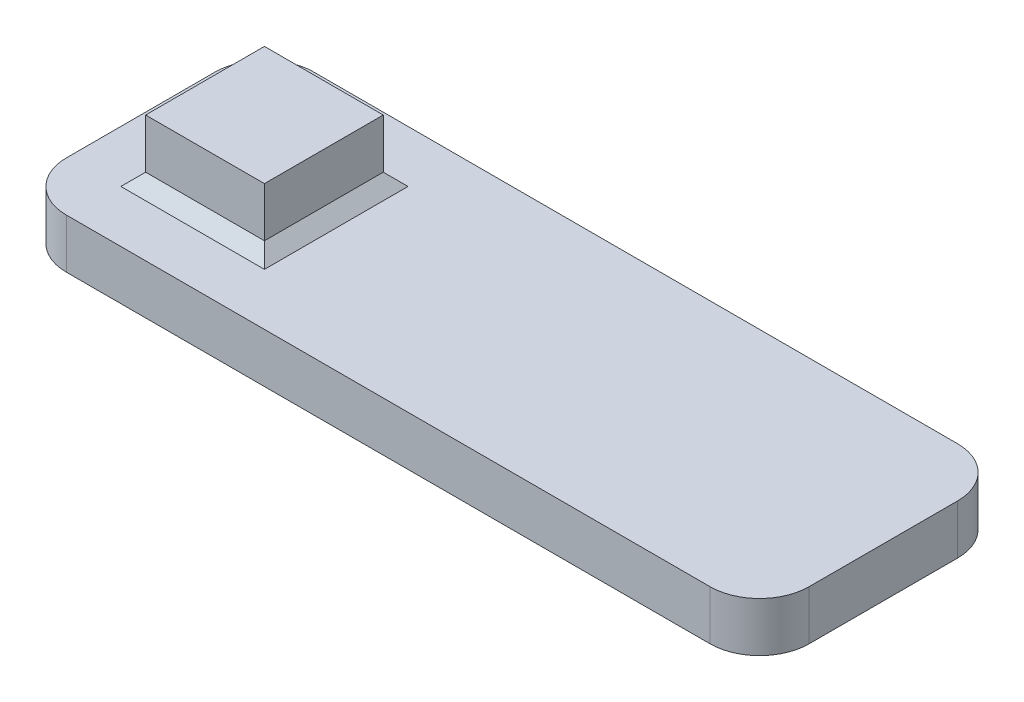
ISO-10303-21;
HEADER;
FILE_DESCRIPTION(('STEP AP214'),'2;1');
FILE_NAME('part.step','',(''),(''),'','','');
FILE_SCHEMA(('AUTOMOTIVE_DESIGN { 1 0 10303 214 1 1 1 1 }'));
ENDSEC;
DATA;
#1=APPLICATION_CONTEXT('core data for automotive mechanical design processes');
#2=APPLICATION_PROTOCOL_DEFINITION('international standard','automotive_design',2000,#1);
#3=PRODUCT_CONTEXT('',#1,'mechanical');
#4=PRODUCT('Part','Part','',(#3));
#5=PRODUCT_RELATED_PRODUCT_CATEGORY('part','',(#4));
#6=PRODUCT_DEFINITION_FORMATION('','',#4);
#7=PRODUCT_DEFINITION_CONTEXT('part definition',#1,'design');
#8=PRODUCT_DEFINITION('design','',#6,#7);
#9=PRODUCT_DEFINITION_SHAPE('','',#8);
#10=(LENGTH_UNIT() NAMED_UNIT(*) SI_UNIT(.MILLI.,.METRE.));
#11=(NAMED_UNIT(*) PLANE_ANGLE_UNIT() SI_UNIT($,.RADIAN.));
#12=(NAMED_UNIT(*) SI_UNIT($,.STERADIAN.) SOLID_ANGLE_UNIT());
#13=UNCERTAINTY_MEASURE_WITH_UNIT(LENGTH_MEASURE(1.E-05),#10,'distance_accuracy_value','');
#14=(GEOMETRIC_REPRESENTATION_CONTEXT(3) GLOBAL_UNCERTAINTY_ASSIGNED_CONTEXT((#13)) GLOBAL_UNIT_ASSIGNED_CONTEXT((#10,
#11,#12)) REPRESENTATION_CONTEXT('',''));
#15=CARTESIAN_POINT('',(0.,0.,0.));
#16=DIRECTION('',(0.,0.,1.));
#17=DIRECTION('',(1.,0.,0.));
#18=AXIS2_PLACEMENT_3D('',#15,#16,#17);
#19=CARTESIAN_POINT('',(28.,2.,-2.));
#20=DIRECTION('',(0.,1.,0.));
#21=DIRECTION('',(0.,0.,1.));
#22=AXIS2_PLACEMENT_3D('',#19,#20,#21);
#23=CYLINDRICAL_SURFACE('',#22,2.);
#24=DIRECTION('',(0.,1.,0.));
#25=VECTOR('',#24,1.);
#26=CARTESIAN_POINT('',(28.,2.,0.));
#27=LINE('',#26,#25);
#28=CARTESIAN_POINT('',(28.,0.,0.));
#29=VERTEX_POINT('',#28);
#30=CARTESIAN_POINT('',(28.,2.,0.));
#31=VERTEX_POINT('',#30);
#32=EDGE_CURVE('E235',#29,#31,#27,.T.);
#33=ORIENTED_EDGE('',*,*,#32,.F.);
#34=CARTESIAN_POINT('',(28.,0.,-2.));
#35=DIRECTION('',(0.,-1.,0.));
#36=DIRECTION('',(0.,0.,-1.));
#37=AXIS2_PLACEMENT_3D('',#34,#35,#36);
#38=CIRCLE('',#37,2.);
#39=CARTESIAN_POINT('',(30.,0.,-2.));
#40=VERTEX_POINT('',#39);
#41=EDGE_CURVE('E40',#40,#29,#38,.T.);
#42=ORIENTED_EDGE('',*,*,#41,.F.);
#43=DIRECTION('',(0.,1.,0.));
#44=VECTOR('',#43,1.);
#45=CARTESIAN_POINT('',(30.,2.,-2.));
#46=LINE('',#45,#44);
#47=CARTESIAN_POINT('',(30.,2.,-2.));
#48=VERTEX_POINT('',#47);
#49=EDGE_CURVE('E238',#48,#40,#46,.F.);
#50=ORIENTED_EDGE('',*,*,#49,.F.);
#51=CARTESIAN_POINT('',(28.,2.,-2.));
#52=DIRECTION('',(0.,-1.,0.));
#53=DIRECTION('',(0.,0.,-1.));
#54=AXIS2_PLACEMENT_3D('',#51,#52,#53);
#55=CIRCLE('',#54,2.);
#56=EDGE_CURVE('E11',#31,#48,#55,.F.);
#57=ORIENTED_EDGE('',*,*,#56,.F.);
#58=EDGE_LOOP('',(#33,#42,#50,#57));
#59=FACE_BOUND('',#58,.T.);
#60=ADVANCED_FACE('F33',(#59),#23,.T.);
#61=CARTESIAN_POINT('',(28.,2.,-8.));
#62=DIRECTION('',(0.,1.,0.));
#63=DIRECTION('',(0.,0.,1.));
#64=AXIS2_PLACEMENT_3D('',#61,#62,#63);
#65=CYLINDRICAL_SURFACE('',#64,2.);
#66=DIRECTION('',(0.,1.,0.));
#67=VECTOR('',#66,1.);
#68=CARTESIAN_POINT('',(30.,2.,-8.));
#69=LINE('',#68,#67);
#70=CARTESIAN_POINT('',(30.,0.,-8.));
#71=VERTEX_POINT('',#70);
#72=CARTESIAN_POINT('',(30.,2.,-8.));
#73=VERTEX_POINT('',#72);
#74=EDGE_CURVE('E224',#71,#73,#69,.T.);
#75=ORIENTED_EDGE('',*,*,#74,.F.);
#76=CARTESIAN_POINT('',(28.,0.,-8.));
#77=DIRECTION('',(0.,-1.,0.));
#78=DIRECTION('',(0.,0.,-1.));
#79=AXIS2_PLACEMENT_3D('',#76,#77,#78);
#80=CIRCLE('',#79,2.);
#81=CARTESIAN_POINT('',(28.,0.,-10.));
#82=VERTEX_POINT('',#81);
#83=EDGE_CURVE('E230',#82,#71,#80,.T.);
#84=ORIENTED_EDGE('',*,*,#83,.F.);
#85=DIRECTION('',(0.,1.,0.));
#86=VECTOR('',#85,1.);
#87=CARTESIAN_POINT('',(28.,2.,-10.));
#88=LINE('',#87,#86);
#89=CARTESIAN_POINT('',(28.,2.,-10.));
#90=VERTEX_POINT('',#89);
#91=EDGE_CURVE('E227',#90,#82,#88,.F.);
#92=ORIENTED_EDGE('',*,*,#91,.F.);
#93=CARTESIAN_POINT('',(28.,2.,-8.));
#94=DIRECTION('',(0.,-1.,0.));
#95=DIRECTION('',(0.,0.,-1.));
#96=AXIS2_PLACEMENT_3D('',#93,#94,#95);
#97=CIRCLE('',#96,2.);
#98=EDGE_CURVE('E233',#73,#90,#97,.F.);
#99=ORIENTED_EDGE('',*,*,#98,.F.);
#100=EDGE_LOOP('',(#75,#84,#92,#99));
#101=FACE_BOUND('',#100,.T.);
#102=ADVANCED_FACE('F268',(#101),#65,.T.);
#103=CARTESIAN_POINT('',(2.,2.,-8.));
#104=DIRECTION('',(0.,1.,0.));
#105=DIRECTION('',(0.,0.,1.));
#106=AXIS2_PLACEMENT_3D('',#103,#104,#105);
#107=CYLINDRICAL_SURFACE('',#106,2.);
#108=DIRECTION('',(0.,1.,0.));
#109=VECTOR('',#108,1.);
#110=CARTESIAN_POINT('',(2.,2.,-10.));
#111=LINE('',#110,#109);
#112=CARTESIAN_POINT('',(2.,0.,-10.));
#113=VERTEX_POINT('',#112);
#114=CARTESIAN_POINT('',(2.,2.,-10.));
#115=VERTEX_POINT('',#114);
#116=EDGE_CURVE('E213',#113,#115,#111,.T.);
#117=ORIENTED_EDGE('',*,*,#116,.F.);
#118=CARTESIAN_POINT('',(2.,0.,-8.));
#119=DIRECTION('',(0.,-1.,0.));
#120=DIRECTION('',(0.,0.,-1.));
#121=AXIS2_PLACEMENT_3D('',#118,#119,#120);
#122=CIRCLE('',#121,2.);
#123=CARTESIAN_POINT('',(0.,0.,-8.));
#124=VERTEX_POINT('',#123);
#125=EDGE_CURVE('E219',#124,#113,#122,.T.);
#126=ORIENTED_EDGE('',*,*,#125,.F.);
#127=DIRECTION('',(0.,1.,0.));
#128=VECTOR('',#127,1.);
#129=CARTESIAN_POINT('',(0.,2.,-8.));
#130=LINE('',#129,#128);
#131=CARTESIAN_POINT('',(0.,2.,-8.));
#132=VERTEX_POINT('',#131);
#133=EDGE_CURVE('E216',#132,#124,#130,.F.);
#134=ORIENTED_EDGE('',*,*,#133,.F.);
#135=CARTESIAN_POINT('',(2.,2.,-8.));
#136=DIRECTION('',(0.,-1.,0.));
#137=DIRECTION('',(0.,0.,-1.));
#138=AXIS2_PLACEMENT_3D('',#135,#136,#137);
#139=CIRCLE('',#138,2.);
#140=EDGE_CURVE('E222',#115,#132,#139,.F.);
#141=ORIENTED_EDGE('',*,*,#140,.F.);
#142=EDGE_LOOP('',(#117,#126,#134,#141));
#143=FACE_BOUND('',#142,.T.);
#144=ADVANCED_FACE('F260',(#143),#107,.T.);
#145=CARTESIAN_POINT('',(2.,2.,-2.));
#146=DIRECTION('',(0.,1.,0.));
#147=DIRECTION('',(0.,0.,1.));
#148=AXIS2_PLACEMENT_3D('',#145,#146,#147);
#149=CYLINDRICAL_SURFACE('',#148,2.);
#150=DIRECTION('',(0.,1.,0.));
#151=VECTOR('',#150,1.);
#152=CARTESIAN_POINT('',(0.,2.,-2.));
#153=LINE('',#152,#151);
#154=CARTESIAN_POINT('',(0.,0.,-2.));
#155=VERTEX_POINT('',#154);
#156=CARTESIAN_POINT('',(0.,2.,-2.));
#157=VERTEX_POINT('',#156);
#158=EDGE_CURVE('E193',#155,#157,#153,.T.);
#159=ORIENTED_EDGE('',*,*,#158,.F.);
#160=CARTESIAN_POINT('',(2.,0.,-2.));
#161=DIRECTION('',(0.,-1.,0.));
#162=DIRECTION('',(0.,0.,-1.));
#163=AXIS2_PLACEMENT_3D('',#160,#161,#162);
#164=CIRCLE('',#163,2.);
#165=CARTESIAN_POINT('',(2.,0.,0.));
#166=VERTEX_POINT('',#165);
#167=EDGE_CURVE('E208',#166,#155,#164,.T.);
#168=ORIENTED_EDGE('',*,*,#167,.F.);
#169=DIRECTION('',(0.,1.,0.));
#170=VECTOR('',#169,1.);
#171=CARTESIAN_POINT('',(2.,2.,0.));
#172=LINE('',#171,#170);
#173=CARTESIAN_POINT('',(2.,2.,0.));
#174=VERTEX_POINT('',#173);
#175=EDGE_CURVE('E205',#174,#166,#172,.F.);
#176=ORIENTED_EDGE('',*,*,#175,.F.);
#177=CARTESIAN_POINT('',(2.,2.,-2.));
#178=DIRECTION('',(0.,-1.,0.));
#179=DIRECTION('',(0.,0.,-1.));
#180=AXIS2_PLACEMENT_3D('',#177,#178,#179);
#181=CIRCLE('',#180,2.);
#182=EDGE_CURVE('E211',#157,#174,#181,.F.);
#183=ORIENTED_EDGE('',*,*,#182,.F.);
#184=EDGE_LOOP('',(#159,#168,#176,#183));
#185=FACE_BOUND('',#184,.T.);
#186=ADVANCED_FACE('F250',(#185),#149,.T.);
#187=CARTESIAN_POINT('',(0.,2.,0.));
#188=DIRECTION('',(0.,-1.,0.));
#189=DIRECTION('',(0.,0.,-1.));
#190=AXIS2_PLACEMENT_3D('',#187,#188,#189);
#191=PLANE('',#190);
#192=DIRECTION('',(1.,0.,0.));
#193=VECTOR('',#192,1.);
#194=CARTESIAN_POINT('',(7.4,2.,-7.89999999999999));
#195=LINE('',#194,#193);
#196=CARTESIAN_POINT('',(2.10000000000001,2.,-7.89999999999999));
#197=VERTEX_POINT('',#196);
#198=CARTESIAN_POINT('',(7.89999999999999,2.,-7.89999999999999));
#199=VERTEX_POINT('',#198);
#200=EDGE_CURVE('E182',#197,#199,#195,.T.);
#201=ORIENTED_EDGE('',*,*,#200,.T.);
#202=DIRECTION('',(0.,0.,1.));
#203=VECTOR('',#202,1.);
#204=CARTESIAN_POINT('',(7.89999999999999,2.,-2.6));
#205=LINE('',#204,#203);
#206=CARTESIAN_POINT('',(7.89999999999999,2.,-2.10000000000001));
#207=VERTEX_POINT('',#206);
#208=EDGE_CURVE('E184',#199,#207,#205,.T.);
#209=ORIENTED_EDGE('',*,*,#208,.T.);
#210=DIRECTION('',(-1.,0.,0.));
#211=VECTOR('',#210,1.);
#212=CARTESIAN_POINT('',(2.6,2.,-2.10000000000001));
#213=LINE('',#212,#211);
#214=CARTESIAN_POINT('',(2.10000000000001,2.,-2.10000000000001));
#215=VERTEX_POINT('',#214);
#216=EDGE_CURVE('E178',#207,#215,#213,.T.);
#217=ORIENTED_EDGE('',*,*,#216,.T.);
#218=DIRECTION('',(0.,0.,-1.));
#219=VECTOR('',#218,1.);
#220=CARTESIAN_POINT('',(2.10000000000001,2.,-7.4));
#221=LINE('',#220,#219);
#222=EDGE_CURVE('E180',#215,#197,#221,.T.);
#223=ORIENTED_EDGE('',*,*,#222,.T.);
#224=EDGE_LOOP('',(#201,#209,#217,#223));
#225=FACE_BOUND('',#224,.T.);
#226=DIRECTION('',(1.,0.,0.));
#227=VECTOR('',#226,1.);
#228=CARTESIAN_POINT('',(0.,2.,0.));
#229=LINE('',#228,#227);
#230=EDGE_CURVE('E165',#174,#31,#229,.T.);
#231=ORIENTED_EDGE('',*,*,#230,.T.);
#232=ORIENTED_EDGE('',*,*,#56,.T.);
#233=DIRECTION('',(0.,0.,-1.));
#234=VECTOR('',#233,1.);
#235=CARTESIAN_POINT('',(30.,2.,0.));
#236=LINE('',#235,#234);
#237=EDGE_CURVE('E168',#48,#73,#236,.T.);
#238=ORIENTED_EDGE('',*,*,#237,.T.);
#239=ORIENTED_EDGE('',*,*,#98,.T.);
#240=DIRECTION('',(-1.,0.,0.));
#241=VECTOR('',#240,1.);
#242=CARTESIAN_POINT('',(0.,2.,-10.));
#243=LINE('',#242,#241);
#244=EDGE_CURVE('E170',#90,#115,#243,.T.);
#245=ORIENTED_EDGE('',*,*,#244,.T.);
#246=ORIENTED_EDGE('',*,*,#140,.T.);
#247=DIRECTION('',(0.,0.,1.));
#248=VECTOR('',#247,1.);
#249=CARTESIAN_POINT('',(0.,2.,0.));
#250=LINE('',#249,#248);
#251=EDGE_CURVE('E163',#132,#157,#250,.T.);
#252=ORIENTED_EDGE('',*,*,#251,.T.);
#253=ORIENTED_EDGE('',*,*,#182,.T.);
#254=EDGE_LOOP('',(#231,#232,#238,#239,#245,#246,#252,#253));
#255=FACE_BOUND('',#254,.T.);
#256=ADVANCED_FACE('F272',(#225,#255),#191,.F.);
#257=CARTESIAN_POINT('',(0.,2.,0.));
#258=DIRECTION('',(1.,0.,0.));
#259=DIRECTION('',(0.,0.,-1.));
#260=AXIS2_PLACEMENT_3D('',#257,#258,#259);
#261=PLANE('',#260);
#262=ORIENTED_EDGE('',*,*,#251,.F.);
#263=ORIENTED_EDGE('',*,*,#133,.T.);
#264=DIRECTION('',(0.,0.,1.));
#265=VECTOR('',#264,1.);
#266=CARTESIAN_POINT('',(0.,0.,0.));
#267=LINE('',#266,#265);
#268=EDGE_CURVE('E155',#124,#155,#267,.T.);
#269=ORIENTED_EDGE('',*,*,#268,.T.);
#270=ORIENTED_EDGE('',*,*,#158,.T.);
#271=EDGE_LOOP('',(#262,#263,#269,#270));
#272=FACE_BOUND('',#271,.T.);
#273=ADVANCED_FACE('F256',(#272),#261,.F.);
#274=CARTESIAN_POINT('',(0.,2.,0.));
#275=DIRECTION('',(0.,0.,-1.));
#276=DIRECTION('',(-1.,0.,0.));
#277=AXIS2_PLACEMENT_3D('',#274,#275,#276);
#278=PLANE('',#277);
#279=DIRECTION('',(1.,0.,0.));
#280=VECTOR('',#279,1.);
#281=CARTESIAN_POINT('',(0.,0.,0.));
#282=LINE('',#281,#280);
#283=EDGE_CURVE('E157',#166,#29,#282,.T.);
#284=ORIENTED_EDGE('',*,*,#283,.T.);
#285=ORIENTED_EDGE('',*,*,#32,.T.);
#286=ORIENTED_EDGE('',*,*,#230,.F.);
#287=ORIENTED_EDGE('',*,*,#175,.T.);
#288=EDGE_LOOP('',(#284,#285,#286,#287));
#289=FACE_BOUND('',#288,.T.);
#290=ADVANCED_FACE('F245',(#289),#278,.F.);
#291=CARTESIAN_POINT('',(30.,2.,0.));
#292=DIRECTION('',(-1.,0.,0.));
#293=DIRECTION('',(0.,0.,1.));
#294=AXIS2_PLACEMENT_3D('',#291,#292,#293);
#295=PLANE('',#294);
#296=ORIENTED_EDGE('',*,*,#237,.F.);
#297=ORIENTED_EDGE('',*,*,#49,.T.);
#298=DIRECTION('',(0.,0.,-1.));
#299=VECTOR('',#298,1.);
#300=CARTESIAN_POINT('',(30.,0.,0.));
#301=LINE('',#300,#299);
#302=EDGE_CURVE('E174',#40,#71,#301,.T.);
#303=ORIENTED_EDGE('',*,*,#302,.T.);
#304=ORIENTED_EDGE('',*,*,#74,.T.);
#305=EDGE_LOOP('',(#296,#297,#303,#304));
#306=FACE_BOUND('',#305,.T.);
#307=ADVANCED_FACE('F271',(#306),#295,.F.);
#308=CARTESIAN_POINT('',(0.,2.,-10.));
#309=DIRECTION('',(0.,0.,1.));
#310=DIRECTION('',(1.,0.,0.));
#311=AXIS2_PLACEMENT_3D('',#308,#309,#310);
#312=PLANE('',#311);
#313=ORIENTED_EDGE('',*,*,#244,.F.);
#314=ORIENTED_EDGE('',*,*,#91,.T.);
#315=DIRECTION('',(-1.,0.,0.));
#316=VECTOR('',#315,1.);
#317=CARTESIAN_POINT('',(0.,0.,-10.));
#318=LINE('',#317,#316);
#319=EDGE_CURVE('E166',#82,#113,#318,.T.);
#320=ORIENTED_EDGE('',*,*,#319,.T.);
#321=ORIENTED_EDGE('',*,*,#116,.T.);
#322=EDGE_LOOP('',(#313,#314,#320,#321));
#323=FACE_BOUND('',#322,.T.);
#324=ADVANCED_FACE('F263',(#323),#312,.F.);
#325=CARTESIAN_POINT('',(0.,0.,0.));
#326=DIRECTION('',(0.,-1.,0.));
#327=DIRECTION('',(0.,0.,-1.));
#328=AXIS2_PLACEMENT_3D('',#325,#326,#327);
#329=PLANE('',#328);
#330=ORIENTED_EDGE('',*,*,#302,.F.);
#331=ORIENTED_EDGE('',*,*,#41,.T.);
#332=ORIENTED_EDGE('',*,*,#283,.F.);
#333=ORIENTED_EDGE('',*,*,#167,.T.);
#334=ORIENTED_EDGE('',*,*,#268,.F.);
#335=ORIENTED_EDGE('',*,*,#125,.T.);
#336=ORIENTED_EDGE('',*,*,#319,.F.);
#337=ORIENTED_EDGE('',*,*,#83,.T.);
#338=EDGE_LOOP('',(#330,#331,#332,#333,#334,#335,#336,#337));
#339=FACE_BOUND('',#338,.T.);
#340=ADVANCED_FACE('F242',(#339),#329,.T.);
#341=CARTESIAN_POINT('',(7.4,4.5,-7.4));
#342=DIRECTION('',(-1.,0.,0.));
#343=DIRECTION('',(0.,0.,1.));
#344=AXIS2_PLACEMENT_3D('',#341,#342,#343);
#345=PLANE('',#344);
#346=DIRECTION('',(0.,-1.,0.));
#347=VECTOR('',#346,1.);
#348=CARTESIAN_POINT('',(7.4,4.5,-2.6));
#349=LINE('',#348,#347);
#350=CARTESIAN_POINT('',(7.4,4.5,-2.6));
#351=VERTEX_POINT('',#350);
#352=CARTESIAN_POINT('',(7.4,2.5,-2.6));
#353=VERTEX_POINT('',#352);
#354=EDGE_CURVE('E440',#351,#353,#349,.T.);
#355=ORIENTED_EDGE('',*,*,#354,.T.);
#356=DIRECTION('',(0.,0.,-1.));
#357=VECTOR('',#356,1.);
#358=CARTESIAN_POINT('',(7.4,2.5,-7.4));
#359=LINE('',#358,#357);
#360=CARTESIAN_POINT('',(7.4,2.5,-7.4));
#361=VERTEX_POINT('',#360);
#362=EDGE_CURVE('E154',#353,#361,#359,.T.);
#363=ORIENTED_EDGE('',*,*,#362,.T.);
#364=DIRECTION('',(0.,-1.,0.));
#365=VECTOR('',#364,1.);
#366=CARTESIAN_POINT('',(7.4,4.5,-7.4));
#367=LINE('',#366,#365);
#368=CARTESIAN_POINT('',(7.4,4.5,-7.4));
#369=VERTEX_POINT('',#368);
#370=EDGE_CURVE('E134',#369,#361,#367,.T.);
#371=ORIENTED_EDGE('',*,*,#370,.F.);
#372=DIRECTION('',(0.,0.,-1.));
#373=VECTOR('',#372,1.);
#374=CARTESIAN_POINT('',(7.4,4.5,-7.4));
#375=LINE('',#374,#373);
#376=EDGE_CURVE('E140',#351,#369,#375,.T.);
#377=ORIENTED_EDGE('',*,*,#376,.F.);
#378=EDGE_LOOP('',(#355,#363,#371,#377));
#379=FACE_BOUND('',#378,.T.);
#380=ADVANCED_FACE('F152',(#379),#345,.F.);
#381=CARTESIAN_POINT('',(2.6,4.5,-7.4));
#382=DIRECTION('',(0.,0.,1.));
#383=DIRECTION('',(1.,0.,0.));
#384=AXIS2_PLACEMENT_3D('',#381,#382,#383);
#385=PLANE('',#384);
#386=ORIENTED_EDGE('',*,*,#370,.T.);
#387=DIRECTION('',(-1.,0.,0.));
#388=VECTOR('',#387,1.);
#389=CARTESIAN_POINT('',(2.6,2.5,-7.4));
#390=LINE('',#389,#388);
#391=CARTESIAN_POINT('',(2.6,2.5,-7.4));
#392=VERTEX_POINT('',#391);
#393=EDGE_CURVE('E187',#361,#392,#390,.T.);
#394=ORIENTED_EDGE('',*,*,#393,.T.);
#395=DIRECTION('',(0.,-1.,0.));
#396=VECTOR('',#395,1.);
#397=CARTESIAN_POINT('',(2.6,4.5,-7.4));
#398=LINE('',#397,#396);
#399=CARTESIAN_POINT('',(2.6,4.5,-7.4));
#400=VERTEX_POINT('',#399);
#401=EDGE_CURVE('E136',#400,#392,#398,.T.);
#402=ORIENTED_EDGE('',*,*,#401,.F.);
#403=DIRECTION('',(-1.,0.,0.));
#404=VECTOR('',#403,1.);
#405=CARTESIAN_POINT('',(2.6,4.5,-7.4));
#406=LINE('',#405,#404);
#407=EDGE_CURVE('E130',#369,#400,#406,.T.);
#408=ORIENTED_EDGE('',*,*,#407,.F.);
#409=EDGE_LOOP('',(#386,#394,#402,#408));
#410=FACE_BOUND('',#409,.T.);
#411=ADVANCED_FACE('F132',(#410),#385,.F.);
#412=CARTESIAN_POINT('',(2.6,4.5,-7.4));
#413=DIRECTION('',(1.,0.,0.));
#414=DIRECTION('',(0.,0.,-1.));
#415=AXIS2_PLACEMENT_3D('',#412,#413,#414);
#416=PLANE('',#415);
#417=ORIENTED_EDGE('',*,*,#401,.T.);
#418=DIRECTION('',(0.,0.,1.));
#419=VECTOR('',#418,1.);
#420=CARTESIAN_POINT('',(2.6,2.5,-2.6));
#421=LINE('',#420,#419);
#422=CARTESIAN_POINT('',(2.6,2.5,-2.6));
#423=VERTEX_POINT('',#422);
#424=EDGE_CURVE('E189',#392,#423,#421,.T.);
#425=ORIENTED_EDGE('',*,*,#424,.T.);
#426=DIRECTION('',(0.,-1.,0.));
#427=VECTOR('',#426,1.);
#428=CARTESIAN_POINT('',(2.6,4.5,-2.6));
#429=LINE('',#428,#427);
#430=CARTESIAN_POINT('',(2.6,4.5,-2.6));
#431=VERTEX_POINT('',#430);
#432=EDGE_CURVE('E159',#431,#423,#429,.T.);
#433=ORIENTED_EDGE('',*,*,#432,.F.);
#434=DIRECTION('',(0.,0.,1.));
#435=VECTOR('',#434,1.);
#436=CARTESIAN_POINT('',(2.6,4.5,-7.4));
#437=LINE('',#436,#435);
#438=EDGE_CURVE('E139',#400,#431,#437,.T.);
#439=ORIENTED_EDGE('',*,*,#438,.F.);
#440=EDGE_LOOP('',(#417,#425,#433,#439));
#441=FACE_BOUND('',#440,.T.);
#442=ADVANCED_FACE('F321',(#441),#416,.F.);
#443=CARTESIAN_POINT('',(2.6,4.5,-2.6));
#444=DIRECTION('',(0.,0.,-1.));
#445=DIRECTION('',(-1.,0.,0.));
#446=AXIS2_PLACEMENT_3D('',#443,#444,#445);
#447=PLANE('',#446);
#448=ORIENTED_EDGE('',*,*,#432,.T.);
#449=DIRECTION('',(1.,0.,0.));
#450=VECTOR('',#449,1.);
#451=CARTESIAN_POINT('',(7.4,2.5,-2.6));
#452=LINE('',#451,#450);
#453=EDGE_CURVE('E191',#423,#353,#452,.T.);
#454=ORIENTED_EDGE('',*,*,#453,.T.);
#455=ORIENTED_EDGE('',*,*,#354,.F.);
#456=DIRECTION('',(1.,0.,0.));
#457=VECTOR('',#456,1.);
#458=CARTESIAN_POINT('',(2.6,4.5,-2.6));
#459=LINE('',#458,#457);
#460=EDGE_CURVE('E145',#431,#351,#459,.T.);
#461=ORIENTED_EDGE('',*,*,#460,.F.);
#462=EDGE_LOOP('',(#448,#454,#455,#461));
#463=FACE_BOUND('',#462,.T.);
#464=ADVANCED_FACE('F326',(#463),#447,.F.);
#465=CARTESIAN_POINT('',(0.,4.5,0.));
#466=DIRECTION('',(0.,1.,0.));
#467=DIRECTION('',(0.,0.,1.));
#468=AXIS2_PLACEMENT_3D('',#465,#466,#467);
#469=PLANE('',#468);
#470=ORIENTED_EDGE('',*,*,#376,.T.);
#471=ORIENTED_EDGE('',*,*,#407,.T.);
#472=ORIENTED_EDGE('',*,*,#438,.T.);
#473=ORIENTED_EDGE('',*,*,#460,.T.);
#474=EDGE_LOOP('',(#470,#471,#472,#473));
#475=FACE_BOUND('',#474,.T.);
#476=ADVANCED_FACE('F143',(#475),#469,.T.);
#477=CARTESIAN_POINT('',(2.6,2.5,-7.4));
#478=DIRECTION('',(-0.707106781186553,0.707106781186542,0.));
#479=DIRECTION('',(0.,0.,-1.));
#480=AXIS2_PLACEMENT_3D('',#477,#478,#479);
#481=PLANE('',#480);
#482=DIRECTION('',(-0.577350269189622,-0.577350269189631,-0.577350269189624));
#483=VECTOR('',#482,1.);
#484=CARTESIAN_POINT('',(2.6,2.5,-7.4));
#485=LINE('',#484,#483);
#486=EDGE_CURVE('E198',#197,#392,#485,.F.);
#487=ORIENTED_EDGE('',*,*,#486,.F.);
#488=ORIENTED_EDGE('',*,*,#222,.F.);
#489=DIRECTION('',(-0.577350269189623,-0.577350269189631,0.577350269189623));
#490=VECTOR('',#489,1.);
#491=CARTESIAN_POINT('',(2.6,2.5,-2.6));
#492=LINE('',#491,#490);
#493=EDGE_CURVE('E149',#423,#215,#492,.T.);
#494=ORIENTED_EDGE('',*,*,#493,.F.);
#495=ORIENTED_EDGE('',*,*,#424,.F.);
#496=EDGE_LOOP('',(#487,#488,#494,#495));
#497=FACE_BOUND('',#496,.T.);
#498=ADVANCED_FACE('F293',(#497),#481,.T.);
#499=CARTESIAN_POINT('',(2.6,2.5,-2.6));
#500=DIRECTION('',(0.,0.707106781186543,0.707106781186552));
#501=DIRECTION('',(-1.,0.,0.));
#502=AXIS2_PLACEMENT_3D('',#499,#500,#501);
#503=PLANE('',#502);
#504=ORIENTED_EDGE('',*,*,#493,.T.);
#505=ORIENTED_EDGE('',*,*,#216,.F.);
#506=DIRECTION('',(-0.577350269189624,0.577350269189631,-0.577350269189623));
#507=VECTOR('',#506,1.);
#508=CARTESIAN_POINT('',(5.80000000000001,4.10000000000001,-4.19999999999999));
#509=LINE('',#508,#507);
#510=EDGE_CURVE('E196',#353,#207,#509,.F.);
#511=ORIENTED_EDGE('',*,*,#510,.F.);
#512=ORIENTED_EDGE('',*,*,#453,.F.);
#513=EDGE_LOOP('',(#504,#505,#511,#512));
#514=FACE_BOUND('',#513,.T.);
#515=ADVANCED_FACE('F296',(#514),#503,.T.);
#516=CARTESIAN_POINT('',(2.6,2.5,-7.4));
#517=DIRECTION('',(0.,0.707106781186543,-0.707106781186552));
#518=DIRECTION('',(1.,0.,0.));
#519=AXIS2_PLACEMENT_3D('',#516,#517,#518);
#520=PLANE('',#519);
#521=ORIENTED_EDGE('',*,*,#486,.T.);
#522=ORIENTED_EDGE('',*,*,#393,.F.);
#523=DIRECTION('',(0.577350269189623,-0.577350269189631,-0.577350269189624));
#524=VECTOR('',#523,1.);
#525=CARTESIAN_POINT('',(5.80000000000001,4.1,-5.80000000000001));
#526=LINE('',#525,#524);
#527=EDGE_CURVE('E194',#199,#361,#526,.F.);
#528=ORIENTED_EDGE('',*,*,#527,.F.);
#529=ORIENTED_EDGE('',*,*,#200,.F.);
#530=EDGE_LOOP('',(#521,#522,#528,#529));
#531=FACE_BOUND('',#530,.T.);
#532=ADVANCED_FACE('F300',(#531),#520,.T.);
#533=CARTESIAN_POINT('',(7.4,2.5,-7.4));
#534=DIRECTION('',(0.707106781186552,0.707106781186543,0.));
#535=DIRECTION('',(0.,0.,1.));
#536=AXIS2_PLACEMENT_3D('',#533,#534,#535);
#537=PLANE('',#536);
#538=ORIENTED_EDGE('',*,*,#510,.T.);
#539=ORIENTED_EDGE('',*,*,#208,.F.);
#540=ORIENTED_EDGE('',*,*,#527,.T.);
#541=ORIENTED_EDGE('',*,*,#362,.F.);
#542=EDGE_LOOP('',(#538,#539,#540,#541));
#543=FACE_BOUND('',#542,.T.);
#544=ADVANCED_FACE('F304',(#543),#537,.T.);
#545=CLOSED_SHELL('',(#60,#102,#144,#186,#256,#273,#290,#307,#324,#340,#380,#411,#442,#464,#476,
#498,#515,#532,#544));
#546=MANIFOLD_SOLID_BREP('B2',#545);
#547=ADVANCED_BREP_SHAPE_REPRESENTATION('',(#18,#546),#14);
#548=SHAPE_DEFINITION_REPRESENTATION(#9,#547);
ENDSEC;
END-ISO-10303-21;
